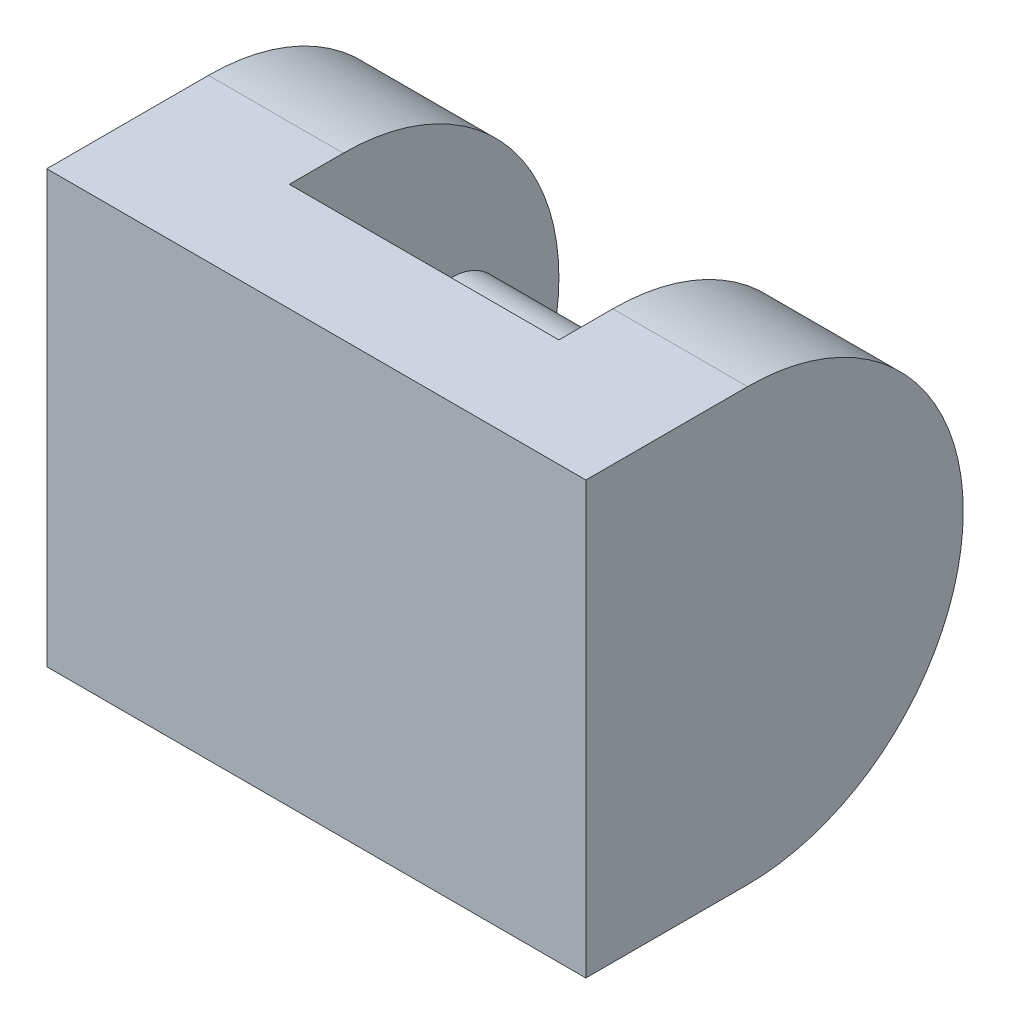
ISO-10303-21;
HEADER;
FILE_DESCRIPTION(('STEP AP214'),'2;1');
FILE_NAME('part.step','',(''),(''),'','','');
FILE_SCHEMA(('AUTOMOTIVE_DESIGN { 1 0 10303 214 1 1 1 1 }'));
ENDSEC;
DATA;
#1=APPLICATION_CONTEXT('core data for automotive mechanical design processes');
#2=APPLICATION_PROTOCOL_DEFINITION('international standard','automotive_design',2000,#1);
#3=PRODUCT_CONTEXT('',#1,'mechanical');
#4=PRODUCT('Part','Part','',(#3));
#5=PRODUCT_RELATED_PRODUCT_CATEGORY('part','',(#4));
#6=PRODUCT_DEFINITION_FORMATION('','',#4);
#7=PRODUCT_DEFINITION_CONTEXT('part definition',#1,'design');
#8=PRODUCT_DEFINITION('design','',#6,#7);
#9=PRODUCT_DEFINITION_SHAPE('','',#8);
#10=(LENGTH_UNIT() NAMED_UNIT(*) SI_UNIT(.MILLI.,.METRE.));
#11=(NAMED_UNIT(*) PLANE_ANGLE_UNIT() SI_UNIT($,.RADIAN.));
#12=(NAMED_UNIT(*) SI_UNIT($,.STERADIAN.) SOLID_ANGLE_UNIT());
#13=UNCERTAINTY_MEASURE_WITH_UNIT(LENGTH_MEASURE(1.E-05),#10,'distance_accuracy_value','');
#14=(GEOMETRIC_REPRESENTATION_CONTEXT(3) GLOBAL_UNCERTAINTY_ASSIGNED_CONTEXT((#13)) GLOBAL_UNIT_ASSIGNED_CONTEXT((#10,
#11,#12)) REPRESENTATION_CONTEXT('',''));
#15=CARTESIAN_POINT('',(0.,0.,0.));
#16=DIRECTION('',(0.,0.,1.));
#17=DIRECTION('',(1.,0.,0.));
#18=AXIS2_PLACEMENT_3D('',#15,#16,#17);
#19=CARTESIAN_POINT('',(-5.,0.,0.));
#20=DIRECTION('',(1.,0.,0.));
#21=DIRECTION('',(0.,0.,-1.));
#22=AXIS2_PLACEMENT_3D('',#19,#20,#21);
#23=CYLINDRICAL_SURFACE('',#22,4.);
#24=CARTESIAN_POINT('',(2.5,0.,0.));
#25=DIRECTION('',(1.,0.,0.));
#26=DIRECTION('',(0.,0.,-1.));
#27=AXIS2_PLACEMENT_3D('',#24,#25,#26);
#28=CIRCLE('',#27,4.);
#29=CARTESIAN_POINT('',(2.5,4.,0.));
#30=VERTEX_POINT('',#29);
#31=CARTESIAN_POINT('',(2.5,-4.,0.));
#32=VERTEX_POINT('',#31);
#33=EDGE_CURVE('E11',#30,#32,#28,.F.);
#34=ORIENTED_EDGE('',*,*,#33,.F.);
#35=DIRECTION('',(-1.,0.,0.));
#36=VECTOR('',#35,1.);
#37=CARTESIAN_POINT('',(-5.,4.,0.));
#38=LINE('',#37,#36);
#39=CARTESIAN_POINT('',(5.,4.,0.));
#40=VERTEX_POINT('',#39);
#41=EDGE_CURVE('E127',#40,#30,#38,.T.);
#42=ORIENTED_EDGE('',*,*,#41,.F.);
#43=CARTESIAN_POINT('',(5.,0.,0.));
#44=DIRECTION('',(1.,0.,0.));
#45=DIRECTION('',(0.,0.,-1.));
#46=AXIS2_PLACEMENT_3D('',#43,#44,#45);
#47=CIRCLE('',#46,4.);
#48=CARTESIAN_POINT('',(5.,-4.,0.));
#49=VERTEX_POINT('',#48);
#50=EDGE_CURVE('E123',#49,#40,#47,.T.);
#51=ORIENTED_EDGE('',*,*,#50,.F.);
#52=DIRECTION('',(1.,0.,0.));
#53=VECTOR('',#52,1.);
#54=CARTESIAN_POINT('',(-5.,-4.,0.));
#55=LINE('',#54,#53);
#56=EDGE_CURVE('E106',#32,#49,#55,.T.);
#57=ORIENTED_EDGE('',*,*,#56,.F.);
#58=EDGE_LOOP('',(#34,#42,#51,#57));
#59=FACE_BOUND('',#58,.T.);
#60=ADVANCED_FACE('F39',(#59),#23,.T.);
#61=CARTESIAN_POINT('',(5.,-4.,3.));
#62=DIRECTION('',(-1.,0.,0.));
#63=DIRECTION('',(0.,0.,1.));
#64=AXIS2_PLACEMENT_3D('',#61,#62,#63);
#65=PLANE('',#64);
#66=DIRECTION('',(0.,0.,-1.));
#67=VECTOR('',#66,1.);
#68=CARTESIAN_POINT('',(5.,-4.,3.));
#69=LINE('',#68,#67);
#70=CARTESIAN_POINT('',(5.,-4.,3.));
#71=VERTEX_POINT('',#70);
#72=EDGE_CURVE('E136',#71,#49,#69,.T.);
#73=ORIENTED_EDGE('',*,*,#72,.T.);
#74=ORIENTED_EDGE('',*,*,#50,.T.);
#75=DIRECTION('',(0.,0.,-1.));
#76=VECTOR('',#75,1.);
#77=CARTESIAN_POINT('',(5.,4.,3.));
#78=LINE('',#77,#76);
#79=CARTESIAN_POINT('',(5.,4.,3.));
#80=VERTEX_POINT('',#79);
#81=EDGE_CURVE('E147',#80,#40,#78,.T.);
#82=ORIENTED_EDGE('',*,*,#81,.F.);
#83=DIRECTION('',(0.,1.,0.));
#84=VECTOR('',#83,1.);
#85=CARTESIAN_POINT('',(5.,-4.,3.));
#86=LINE('',#85,#84);
#87=EDGE_CURVE('E131',#71,#80,#86,.T.);
#88=ORIENTED_EDGE('',*,*,#87,.F.);
#89=EDGE_LOOP('',(#73,#74,#82,#88));
#90=FACE_BOUND('',#89,.T.);
#91=ADVANCED_FACE('F41',(#90),#65,.F.);
#92=CARTESIAN_POINT('',(-5.,4.,3.));
#93=DIRECTION('',(0.,-1.,0.));
#94=DIRECTION('',(0.,0.,-1.));
#95=AXIS2_PLACEMENT_3D('',#92,#93,#94);
#96=PLANE('',#95);
#97=DIRECTION('',(-1.,0.,0.));
#98=VECTOR('',#97,1.);
#99=CARTESIAN_POINT('',(-5.,4.,1.));
#100=LINE('',#99,#98);
#101=CARTESIAN_POINT('',(2.5,4.,1.));
#102=VERTEX_POINT('',#101);
#103=CARTESIAN_POINT('',(-2.5,4.,1.));
#104=VERTEX_POINT('',#103);
#105=EDGE_CURVE('E194',#102,#104,#100,.T.);
#106=ORIENTED_EDGE('',*,*,#105,.T.);
#107=DIRECTION('',(0.,0.,-1.));
#108=VECTOR('',#107,1.);
#109=CARTESIAN_POINT('',(-2.5,4.,3.));
#110=LINE('',#109,#108);
#111=CARTESIAN_POINT('',(-2.5,4.,0.));
#112=VERTEX_POINT('',#111);
#113=EDGE_CURVE('E157',#104,#112,#110,.T.);
#114=ORIENTED_EDGE('',*,*,#113,.T.);
#115=CARTESIAN_POINT('',(-5.,4.,0.));
#116=VERTEX_POINT('',#115);
#117=EDGE_CURVE('E132',#112,#116,#38,.T.);
#118=ORIENTED_EDGE('',*,*,#117,.T.);
#119=DIRECTION('',(0.,0.,-1.));
#120=VECTOR('',#119,1.);
#121=CARTESIAN_POINT('',(-5.,4.,3.));
#122=LINE('',#121,#120);
#123=CARTESIAN_POINT('',(-5.,4.,3.));
#124=VERTEX_POINT('',#123);
#125=EDGE_CURVE('E143',#124,#116,#122,.T.);
#126=ORIENTED_EDGE('',*,*,#125,.F.);
#127=DIRECTION('',(-1.,0.,0.));
#128=VECTOR('',#127,1.);
#129=CARTESIAN_POINT('',(-5.,4.,3.));
#130=LINE('',#129,#128);
#131=EDGE_CURVE('E178',#80,#124,#130,.T.);
#132=ORIENTED_EDGE('',*,*,#131,.F.);
#133=ORIENTED_EDGE('',*,*,#81,.T.);
#134=ORIENTED_EDGE('',*,*,#41,.T.);
#135=DIRECTION('',(0.,0.,1.));
#136=VECTOR('',#135,1.);
#137=CARTESIAN_POINT('',(2.5,4.,3.));
#138=LINE('',#137,#136);
#139=EDGE_CURVE('E118',#30,#102,#138,.T.);
#140=ORIENTED_EDGE('',*,*,#139,.T.);
#141=EDGE_LOOP('',(#106,#114,#118,#126,#132,#133,#134,#140));
#142=FACE_BOUND('',#141,.T.);
#143=ADVANCED_FACE('F193',(#142),#96,.F.);
#144=CARTESIAN_POINT('',(-5.,-4.,3.));
#145=DIRECTION('',(1.,0.,0.));
#146=DIRECTION('',(0.,0.,-1.));
#147=AXIS2_PLACEMENT_3D('',#144,#145,#146);
#148=PLANE('',#147);
#149=ORIENTED_EDGE('',*,*,#125,.T.);
#150=CARTESIAN_POINT('',(-5.,0.,0.));
#151=DIRECTION('',(1.,0.,0.));
#152=DIRECTION('',(0.,0.,-1.));
#153=AXIS2_PLACEMENT_3D('',#150,#151,#152);
#154=CIRCLE('',#153,4.);
#155=CARTESIAN_POINT('',(-5.,-4.,0.));
#156=VERTEX_POINT('',#155);
#157=EDGE_CURVE('E164',#156,#116,#154,.T.);
#158=ORIENTED_EDGE('',*,*,#157,.F.);
#159=DIRECTION('',(0.,0.,-1.));
#160=VECTOR('',#159,1.);
#161=CARTESIAN_POINT('',(-5.,-4.,3.));
#162=LINE('',#161,#160);
#163=CARTESIAN_POINT('',(-5.,-4.,3.));
#164=VERTEX_POINT('',#163);
#165=EDGE_CURVE('E139',#164,#156,#162,.T.);
#166=ORIENTED_EDGE('',*,*,#165,.F.);
#167=DIRECTION('',(0.,-1.,0.));
#168=VECTOR('',#167,1.);
#169=CARTESIAN_POINT('',(-5.,-4.,3.));
#170=LINE('',#169,#168);
#171=EDGE_CURVE('E181',#124,#164,#170,.T.);
#172=ORIENTED_EDGE('',*,*,#171,.F.);
#173=EDGE_LOOP('',(#149,#158,#166,#172));
#174=FACE_BOUND('',#173,.T.);
#175=ADVANCED_FACE('F188',(#174),#148,.F.);
#176=CARTESIAN_POINT('',(-5.,-4.,3.));
#177=DIRECTION('',(0.,1.,0.));
#178=DIRECTION('',(0.,0.,1.));
#179=AXIS2_PLACEMENT_3D('',#176,#177,#178);
#180=PLANE('',#179);
#181=CARTESIAN_POINT('',(-2.5,-4.,0.));
#182=VERTEX_POINT('',#181);
#183=EDGE_CURVE('E126',#156,#182,#55,.T.);
#184=ORIENTED_EDGE('',*,*,#183,.T.);
#185=DIRECTION('',(0.,0.,-1.));
#186=VECTOR('',#185,1.);
#187=CARTESIAN_POINT('',(-2.5,-4.,0.));
#188=LINE('',#187,#186);
#189=CARTESIAN_POINT('',(-2.5,-4.,1.));
#190=VERTEX_POINT('',#189);
#191=EDGE_CURVE('E159',#190,#182,#188,.T.);
#192=ORIENTED_EDGE('',*,*,#191,.F.);
#193=DIRECTION('',(-1.,0.,0.));
#194=VECTOR('',#193,1.);
#195=CARTESIAN_POINT('',(-2.5,-4.,1.));
#196=LINE('',#195,#194);
#197=CARTESIAN_POINT('',(2.5,-4.,1.));
#198=VERTEX_POINT('',#197);
#199=EDGE_CURVE('E110',#198,#190,#196,.T.);
#200=ORIENTED_EDGE('',*,*,#199,.F.);
#201=DIRECTION('',(0.,0.,1.));
#202=VECTOR('',#201,1.);
#203=CARTESIAN_POINT('',(2.5,-4.,1.));
#204=LINE('',#203,#202);
#205=EDGE_CURVE('E102',#32,#198,#204,.T.);
#206=ORIENTED_EDGE('',*,*,#205,.F.);
#207=ORIENTED_EDGE('',*,*,#56,.T.);
#208=ORIENTED_EDGE('',*,*,#72,.F.);
#209=DIRECTION('',(1.,0.,0.));
#210=VECTOR('',#209,1.);
#211=CARTESIAN_POINT('',(-5.,-4.,3.));
#212=LINE('',#211,#210);
#213=EDGE_CURVE('E57',#164,#71,#212,.T.);
#214=ORIENTED_EDGE('',*,*,#213,.F.);
#215=ORIENTED_EDGE('',*,*,#165,.T.);
#216=EDGE_LOOP('',(#184,#192,#200,#206,#207,#208,#214,#215));
#217=FACE_BOUND('',#216,.T.);
#218=ADVANCED_FACE('F104',(#217),#180,.F.);
#219=CARTESIAN_POINT('',(0.,0.,3.));
#220=DIRECTION('',(0.,0.,-1.));
#221=DIRECTION('',(-1.,0.,0.));
#222=AXIS2_PLACEMENT_3D('',#219,#220,#221);
#223=PLANE('',#222);
#224=ORIENTED_EDGE('',*,*,#87,.T.);
#225=ORIENTED_EDGE('',*,*,#131,.T.);
#226=ORIENTED_EDGE('',*,*,#171,.T.);
#227=ORIENTED_EDGE('',*,*,#213,.T.);
#228=EDGE_LOOP('',(#224,#225,#226,#227));
#229=FACE_BOUND('',#228,.T.);
#230=ADVANCED_FACE('F186',(#229),#223,.F.);
#231=CARTESIAN_POINT('',(-2.5,0.,0.));
#232=DIRECTION('',(-1.,0.,0.));
#233=DIRECTION('',(0.,0.,1.));
#234=AXIS2_PLACEMENT_3D('',#231,#232,#233);
#235=CIRCLE('',#234,4.);
#236=EDGE_CURVE('E50',#182,#112,#235,.F.);
#237=ORIENTED_EDGE('',*,*,#236,.F.);
#238=ORIENTED_EDGE('',*,*,#183,.F.);
#239=ORIENTED_EDGE('',*,*,#157,.T.);
#240=ORIENTED_EDGE('',*,*,#117,.F.);
#241=EDGE_LOOP('',(#237,#238,#239,#240));
#242=FACE_BOUND('',#241,.T.);
#243=ADVANCED_FACE('F162',(#242),#23,.T.);
#244=CARTESIAN_POINT('',(2.5,-4.,-10.));
#245=DIRECTION('',(1.,0.,0.));
#246=DIRECTION('',(0.,0.,-1.));
#247=AXIS2_PLACEMENT_3D('',#244,#245,#246);
#248=PLANE('',#247);
#249=CARTESIAN_POINT('',(2.5,0.,-2.));
#250=DIRECTION('',(1.,0.,0.));
#251=DIRECTION('',(0.,0.,-1.));
#252=AXIS2_PLACEMENT_3D('',#249,#250,#251);
#253=CIRCLE('',#252,1.);
#254=CARTESIAN_POINT('',(2.5,0.,-3.));
#255=VERTEX_POINT('',#254);
#256=EDGE_CURVE('E171',#255,#255,#253,.T.);
#257=ORIENTED_EDGE('',*,*,#256,.T.);
#258=EDGE_LOOP('',(#257));
#259=FACE_BOUND('',#258,.T.);
#260=ORIENTED_EDGE('',*,*,#33,.T.);
#261=ORIENTED_EDGE('',*,*,#205,.T.);
#262=DIRECTION('',(0.,-1.,0.));
#263=VECTOR('',#262,1.);
#264=CARTESIAN_POINT('',(2.5,6.,1.));
#265=LINE('',#264,#263);
#266=EDGE_CURVE('E201',#102,#198,#265,.T.);
#267=ORIENTED_EDGE('',*,*,#266,.F.);
#268=ORIENTED_EDGE('',*,*,#139,.F.);
#269=EDGE_LOOP('',(#260,#261,#267,#268));
#270=FACE_BOUND('',#269,.T.);
#271=ADVANCED_FACE('F116',(#259,#270),#248,.F.);
#272=CARTESIAN_POINT('',(-2.5,-4.,-10.));
#273=DIRECTION('',(-1.,0.,0.));
#274=DIRECTION('',(0.,0.,1.));
#275=AXIS2_PLACEMENT_3D('',#272,#273,#274);
#276=PLANE('',#275);
#277=CARTESIAN_POINT('',(-2.5,0.,-2.));
#278=DIRECTION('',(-1.,0.,0.));
#279=DIRECTION('',(0.,0.,1.));
#280=AXIS2_PLACEMENT_3D('',#277,#278,#279);
#281=CIRCLE('',#280,1.);
#282=CARTESIAN_POINT('',(-2.5,0.,-1.));
#283=VERTEX_POINT('',#282);
#284=EDGE_CURVE('E43',#283,#283,#281,.T.);
#285=ORIENTED_EDGE('',*,*,#284,.T.);
#286=EDGE_LOOP('',(#285));
#287=FACE_BOUND('',#286,.T.);
#288=ORIENTED_EDGE('',*,*,#236,.T.);
#289=ORIENTED_EDGE('',*,*,#113,.F.);
#290=DIRECTION('',(0.,-1.,0.));
#291=VECTOR('',#290,1.);
#292=CARTESIAN_POINT('',(-2.5,6.,1.));
#293=LINE('',#292,#291);
#294=EDGE_CURVE('E196',#104,#190,#293,.T.);
#295=ORIENTED_EDGE('',*,*,#294,.T.);
#296=ORIENTED_EDGE('',*,*,#191,.T.);
#297=EDGE_LOOP('',(#288,#289,#295,#296));
#298=FACE_BOUND('',#297,.T.);
#299=ADVANCED_FACE('F156',(#287,#298),#276,.F.);
#300=CARTESIAN_POINT('',(5.,0.,-2.));
#301=DIRECTION('',(-1.,0.,0.));
#302=DIRECTION('',(0.,0.,1.));
#303=AXIS2_PLACEMENT_3D('',#300,#301,#302);
#304=CYLINDRICAL_SURFACE('',#303,1.);
#305=ORIENTED_EDGE('',*,*,#284,.F.);
#306=EDGE_LOOP('',(#305));
#307=FACE_BOUND('',#306,.T.);
#308=ORIENTED_EDGE('',*,*,#256,.F.);
#309=EDGE_LOOP('',(#308));
#310=FACE_BOUND('',#309,.T.);
#311=ADVANCED_FACE('F214',(#307,#310),#304,.T.);
#312=CARTESIAN_POINT('',(-2.5,6.,1.));
#313=DIRECTION('',(0.,0.,1.));
#314=DIRECTION('',(1.,0.,0.));
#315=AXIS2_PLACEMENT_3D('',#312,#313,#314);
#316=PLANE('',#315);
#317=ORIENTED_EDGE('',*,*,#266,.T.);
#318=ORIENTED_EDGE('',*,*,#199,.T.);
#319=ORIENTED_EDGE('',*,*,#294,.F.);
#320=ORIENTED_EDGE('',*,*,#105,.F.);
#321=EDGE_LOOP('',(#317,#318,#319,#320));
#322=FACE_BOUND('',#321,.T.);
#323=ADVANCED_FACE('F216',(#322),#316,.F.);
#324=CLOSED_SHELL('',(#60,#91,#143,#175,#218,#230,#243,#271,#299,#311,#323));
#325=MANIFOLD_SOLID_BREP('B2',#324);
#326=ADVANCED_BREP_SHAPE_REPRESENTATION('',(#18,#325),#14);
#327=SHAPE_DEFINITION_REPRESENTATION(#9,#326);
ENDSEC;
END-ISO-10303-21;
